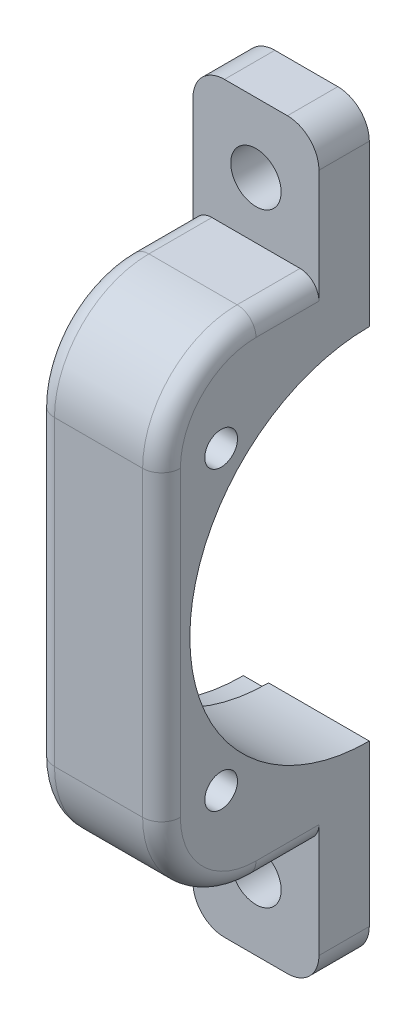
ISO-10303-21;
HEADER;
FILE_DESCRIPTION(('STEP AP214'),'2;1');
FILE_NAME('part.step','',(''),(''),'','','');
FILE_SCHEMA(('AUTOMOTIVE_DESIGN { 1 0 10303 214 1 1 1 1 }'));
ENDSEC;
DATA;
#1=APPLICATION_CONTEXT('core data for automotive mechanical design processes');
#2=APPLICATION_PROTOCOL_DEFINITION('international standard','automotive_design',2000,#1);
#3=PRODUCT_CONTEXT('',#1,'mechanical');
#4=PRODUCT('Part','Part','',(#3));
#5=PRODUCT_RELATED_PRODUCT_CATEGORY('part','',(#4));
#6=PRODUCT_DEFINITION_FORMATION('','',#4);
#7=PRODUCT_DEFINITION_CONTEXT('part definition',#1,'design');
#8=PRODUCT_DEFINITION('design','',#6,#7);
#9=PRODUCT_DEFINITION_SHAPE('','',#8);
#10=(LENGTH_UNIT() NAMED_UNIT(*) SI_UNIT(.MILLI.,.METRE.));
#11=(NAMED_UNIT(*) PLANE_ANGLE_UNIT() SI_UNIT($,.RADIAN.));
#12=(NAMED_UNIT(*) SI_UNIT($,.STERADIAN.) SOLID_ANGLE_UNIT());
#13=UNCERTAINTY_MEASURE_WITH_UNIT(LENGTH_MEASURE(1.E-05),#10,'distance_accuracy_value','');
#14=(GEOMETRIC_REPRESENTATION_CONTEXT(3) GLOBAL_UNCERTAINTY_ASSIGNED_CONTEXT((#13)) GLOBAL_UNIT_ASSIGNED_CONTEXT((#10,
#11,#12)) REPRESENTATION_CONTEXT('',''));
#15=CARTESIAN_POINT('',(0.,0.,0.));
#16=DIRECTION('',(0.,0.,1.));
#17=DIRECTION('',(1.,0.,0.));
#18=AXIS2_PLACEMENT_3D('',#15,#16,#17);
#19=CARTESIAN_POINT('',(-10.,39.,0.));
#20=DIRECTION('',(1.,0.,0.));
#21=DIRECTION('',(0.,0.,-1.));
#22=AXIS2_PLACEMENT_3D('',#19,#20,#21);
#23=CYLINDRICAL_SURFACE('',#22,28.5);
#24=CARTESIAN_POINT('',(4.,39.,0.));
#25=DIRECTION('',(-1.,0.,0.));
#26=DIRECTION('',(0.,0.,1.));
#27=AXIS2_PLACEMENT_3D('',#24,#25,#26);
#28=CIRCLE('',#27,28.5);
#29=CARTESIAN_POINT('',(4.,67.5,0.));
#30=VERTEX_POINT('',#29);
#31=CARTESIAN_POINT('',(4.,10.5,0.));
#32=VERTEX_POINT('',#31);
#33=EDGE_CURVE('E54',#30,#32,#28,.F.);
#34=ORIENTED_EDGE('',*,*,#33,.F.);
#35=DIRECTION('',(1.,0.,0.));
#36=VECTOR('',#35,1.);
#37=CARTESIAN_POINT('',(-10.,67.5,0.));
#38=LINE('',#37,#36);
#39=CARTESIAN_POINT('',(20.,67.5,0.));
#40=VERTEX_POINT('',#39);
#41=EDGE_CURVE('E305',#30,#40,#38,.T.);
#42=ORIENTED_EDGE('',*,*,#41,.T.);
#43=CARTESIAN_POINT('',(20.,39.,0.));
#44=DIRECTION('',(1.,0.,0.));
#45=DIRECTION('',(0.,0.,-1.));
#46=AXIS2_PLACEMENT_3D('',#43,#44,#45);
#47=CIRCLE('',#46,28.5);
#48=CARTESIAN_POINT('',(20.,10.5,0.));
#49=VERTEX_POINT('',#48);
#50=EDGE_CURVE('E443',#40,#49,#47,.T.);
#51=ORIENTED_EDGE('',*,*,#50,.T.);
#52=DIRECTION('',(1.,0.,0.));
#53=VECTOR('',#52,1.);
#54=CARTESIAN_POINT('',(-10.,10.5,0.));
#55=LINE('',#54,#53);
#56=EDGE_CURVE('E301',#49,#32,#55,.F.);
#57=ORIENTED_EDGE('',*,*,#56,.T.);
#58=EDGE_LOOP('',(#34,#42,#51,#57));
#59=FACE_BOUND('',#58,.T.);
#60=ADVANCED_FACE('F45',(#59),#23,.F.);
#61=CARTESIAN_POINT('',(0.,0.,0.));
#62=DIRECTION('',(0.,0.,-1.));
#63=DIRECTION('',(-1.,0.,0.));
#64=AXIS2_PLACEMENT_3D('',#61,#62,#63);
#65=PLANE('',#64);
#66=DIRECTION('',(-1.,0.,0.));
#67=VECTOR('',#66,1.);
#68=CARTESIAN_POINT('',(4.,68.5,0.));
#69=LINE('',#68,#67);
#70=CARTESIAN_POINT('',(0.,68.5,0.));
#71=VERTEX_POINT('',#70);
#72=CARTESIAN_POINT('',(4.,68.5,0.));
#73=VERTEX_POINT('',#72);
#74=EDGE_CURVE('E212',#71,#73,#69,.F.);
#75=ORIENTED_EDGE('',*,*,#74,.F.);
#76=DIRECTION('',(0.,-1.,0.));
#77=VECTOR('',#76,1.);
#78=CARTESIAN_POINT('',(0.,0.,0.));
#79=LINE('',#78,#77);
#80=CARTESIAN_POINT('',(0.,93.,0.));
#81=VERTEX_POINT('',#80);
#82=EDGE_CURVE('E224',#81,#71,#79,.T.);
#83=ORIENTED_EDGE('',*,*,#82,.F.);
#84=CARTESIAN_POINT('',(5.,93.,0.));
#85=DIRECTION('',(0.,0.,-1.));
#86=DIRECTION('',(-1.,0.,0.));
#87=AXIS2_PLACEMENT_3D('',#84,#85,#86);
#88=CIRCLE('',#87,5.);
#89=CARTESIAN_POINT('',(5.,98.,0.));
#90=VERTEX_POINT('',#89);
#91=EDGE_CURVE('E256',#81,#90,#88,.T.);
#92=ORIENTED_EDGE('',*,*,#91,.T.);
#93=DIRECTION('',(-1.,0.,0.));
#94=VECTOR('',#93,1.);
#95=CARTESIAN_POINT('',(0.,98.,0.));
#96=LINE('',#95,#94);
#97=CARTESIAN_POINT('',(15.,98.,0.));
#98=VERTEX_POINT('',#97);
#99=EDGE_CURVE('E495',#98,#90,#96,.T.);
#100=ORIENTED_EDGE('',*,*,#99,.F.);
#101=CARTESIAN_POINT('',(15.,93.,0.));
#102=DIRECTION('',(0.,0.,-1.));
#103=DIRECTION('',(-1.,0.,0.));
#104=AXIS2_PLACEMENT_3D('',#101,#102,#103);
#105=CIRCLE('',#104,5.);
#106=CARTESIAN_POINT('',(20.,93.,0.));
#107=VERTEX_POINT('',#106);
#108=EDGE_CURVE('E259',#98,#107,#105,.T.);
#109=ORIENTED_EDGE('',*,*,#108,.T.);
#110=DIRECTION('',(0.,1.,0.));
#111=VECTOR('',#110,1.);
#112=CARTESIAN_POINT('',(20.,0.,0.));
#113=LINE('',#112,#111);
#114=EDGE_CURVE('E235',#40,#107,#113,.T.);
#115=ORIENTED_EDGE('',*,*,#114,.F.);
#116=ORIENTED_EDGE('',*,*,#41,.F.);
#117=DIRECTION('',(0.,1.,0.));
#118=VECTOR('',#117,1.);
#119=CARTESIAN_POINT('',(4.,0.,0.));
#120=LINE('',#119,#118);
#121=EDGE_CURVE('E61',#30,#73,#120,.T.);
#122=ORIENTED_EDGE('',*,*,#121,.T.);
#123=EDGE_LOOP('',(#75,#83,#92,#100,#109,#115,#116,#122));
#124=FACE_BOUND('',#123,.T.);
#125=CARTESIAN_POINT('',(10.,87.,0.));
#126=DIRECTION('',(0.,0.,-1.));
#127=DIRECTION('',(-1.,0.,0.));
#128=AXIS2_PLACEMENT_3D('',#125,#126,#127);
#129=CIRCLE('',#128,4.);
#130=CARTESIAN_POINT('',(6.,87.,0.));
#131=VERTEX_POINT('',#130);
#132=EDGE_CURVE('E468',#131,#131,#129,.T.);
#133=ORIENTED_EDGE('',*,*,#132,.F.);
#134=EDGE_LOOP('',(#133));
#135=FACE_BOUND('',#134,.T.);
#136=ADVANCED_FACE('F222',(#124,#135),#65,.T.);
#137=CARTESIAN_POINT('',(0.,0.,33.));
#138=DIRECTION('',(0.,1.,0.));
#139=DIRECTION('',(0.,0.,1.));
#140=AXIS2_PLACEMENT_3D('',#137,#138,#139);
#141=PLANE('',#140);
#142=DIRECTION('',(1.,0.,0.));
#143=VECTOR('',#142,1.);
#144=CARTESIAN_POINT('',(0.,0.,18.));
#145=LINE('',#144,#143);
#146=CARTESIAN_POINT('',(17.,0.,18.));
#147=VERTEX_POINT('',#146);
#148=CARTESIAN_POINT('',(3.,0.,18.));
#149=VERTEX_POINT('',#148);
#150=EDGE_CURVE('E316',#147,#149,#145,.F.);
#151=ORIENTED_EDGE('',*,*,#150,.T.);
#152=DIRECTION('',(0.,0.,-1.));
#153=VECTOR('',#152,1.);
#154=CARTESIAN_POINT('',(3.,0.,33.));
#155=LINE('',#154,#153);
#156=CARTESIAN_POINT('',(3.,0.,8.));
#157=VERTEX_POINT('',#156);
#158=EDGE_CURVE('E326',#149,#157,#155,.T.);
#159=ORIENTED_EDGE('',*,*,#158,.T.);
#160=DIRECTION('',(-1.,0.,0.));
#161=VECTOR('',#160,1.);
#162=CARTESIAN_POINT('',(0.,0.,8.));
#163=LINE('',#162,#161);
#164=CARTESIAN_POINT('',(17.,0.,8.));
#165=VERTEX_POINT('',#164);
#166=EDGE_CURVE('E472',#165,#157,#163,.T.);
#167=ORIENTED_EDGE('',*,*,#166,.F.);
#168=DIRECTION('',(0.,0.,-1.));
#169=VECTOR('',#168,1.);
#170=CARTESIAN_POINT('',(17.,0.,33.));
#171=LINE('',#170,#169);
#172=EDGE_CURVE('E323',#165,#147,#171,.F.);
#173=ORIENTED_EDGE('',*,*,#172,.T.);
#174=EDGE_LOOP('',(#151,#159,#167,#173));
#175=FACE_BOUND('',#174,.T.);
#176=ADVANCED_FACE('F567',(#175),#141,.F.);
#177=CARTESIAN_POINT('',(0.,78.,33.));
#178=DIRECTION('',(0.,-1.,0.));
#179=DIRECTION('',(0.,0.,-1.));
#180=AXIS2_PLACEMENT_3D('',#177,#178,#179);
#181=PLANE('',#180);
#182=DIRECTION('',(1.,0.,0.));
#183=VECTOR('',#182,1.);
#184=CARTESIAN_POINT('',(0.,78.,8.));
#185=LINE('',#184,#183);
#186=CARTESIAN_POINT('',(3.,78.,8.));
#187=VERTEX_POINT('',#186);
#188=CARTESIAN_POINT('',(17.,78.,8.));
#189=VERTEX_POINT('',#188);
#190=EDGE_CURVE('E490',#187,#189,#185,.T.);
#191=ORIENTED_EDGE('',*,*,#190,.F.);
#192=DIRECTION('',(0.,0.,-1.));
#193=VECTOR('',#192,1.);
#194=CARTESIAN_POINT('',(3.,78.,33.));
#195=LINE('',#194,#193);
#196=CARTESIAN_POINT('',(3.,78.,18.));
#197=VERTEX_POINT('',#196);
#198=EDGE_CURVE('E382',#187,#197,#195,.F.);
#199=ORIENTED_EDGE('',*,*,#198,.T.);
#200=DIRECTION('',(-1.,0.,0.));
#201=VECTOR('',#200,1.);
#202=CARTESIAN_POINT('',(0.,78.,18.));
#203=LINE('',#202,#201);
#204=CARTESIAN_POINT('',(17.,78.,18.));
#205=VERTEX_POINT('',#204);
#206=EDGE_CURVE('E320',#197,#205,#203,.F.);
#207=ORIENTED_EDGE('',*,*,#206,.T.);
#208=DIRECTION('',(0.,0.,-1.));
#209=VECTOR('',#208,1.);
#210=CARTESIAN_POINT('',(17.,78.,33.));
#211=LINE('',#210,#209);
#212=EDGE_CURVE('E69',#205,#189,#211,.T.);
#213=ORIENTED_EDGE('',*,*,#212,.T.);
#214=EDGE_LOOP('',(#191,#199,#207,#213));
#215=FACE_BOUND('',#214,.T.);
#216=ADVANCED_FACE('F516',(#215),#181,.F.);
#217=CARTESIAN_POINT('',(0.,0.,33.));
#218=DIRECTION('',(1.,0.,0.));
#219=DIRECTION('',(0.,0.,-1.));
#220=AXIS2_PLACEMENT_3D('',#217,#218,#219);
#221=PLANE('',#220);
#222=CARTESIAN_POINT('',(0.,15.4710218560176,23.5289781439824));
#223=DIRECTION('',(1.,0.,0.));
#224=DIRECTION('',(0.,0.,-1.));
#225=AXIS2_PLACEMENT_3D('',#222,#223,#224);
#226=CIRCLE('',#225,2.60000000000003);
#227=CARTESIAN_POINT('',(0.,15.4710218560176,20.9289781439824));
#228=VERTEX_POINT('',#227);
#229=EDGE_CURVE('E448',#228,#228,#226,.T.);
#230=ORIENTED_EDGE('',*,*,#229,.T.);
#231=EDGE_LOOP('',(#230));
#232=FACE_BOUND('',#231,.T.);
#233=CARTESIAN_POINT('',(0.,62.5289781439823,23.5289781439824));
#234=DIRECTION('',(1.,0.,0.));
#235=DIRECTION('',(0.,0.,-1.));
#236=AXIS2_PLACEMENT_3D('',#233,#234,#235);
#237=CIRCLE('',#236,2.60000000000003);
#238=CARTESIAN_POINT('',(0.,62.5289781439823,20.9289781439824));
#239=VERTEX_POINT('',#238);
#240=EDGE_CURVE('E416',#239,#239,#237,.T.);
#241=ORIENTED_EDGE('',*,*,#240,.T.);
#242=EDGE_LOOP('',(#241));
#243=FACE_BOUND('',#242,.T.);
#244=ORIENTED_EDGE('',*,*,#82,.T.);
#245=CARTESIAN_POINT('',(0.,39.,0.));
#246=DIRECTION('',(-1.,0.,0.));
#247=DIRECTION('',(0.,0.,1.));
#248=AXIS2_PLACEMENT_3D('',#245,#246,#247);
#249=CIRCLE('',#248,29.5);
#250=CARTESIAN_POINT('',(0.,9.5,0.));
#251=VERTEX_POINT('',#250);
#252=EDGE_CURVE('E208',#251,#71,#249,.T.);
#253=ORIENTED_EDGE('',*,*,#252,.F.);
#254=CARTESIAN_POINT('',(0.,-15.,0.));
#255=VERTEX_POINT('',#254);
#256=EDGE_CURVE('E236',#251,#255,#79,.T.);
#257=ORIENTED_EDGE('',*,*,#256,.T.);
#258=DIRECTION('',(0.,0.,-1.));
#259=VECTOR('',#258,1.);
#260=CARTESIAN_POINT('',(0.,-15.,33.));
#261=LINE('',#260,#259);
#262=CARTESIAN_POINT('',(0.,-15.,8.));
#263=VERTEX_POINT('',#262);
#264=EDGE_CURVE('E272',#255,#263,#261,.F.);
#265=ORIENTED_EDGE('',*,*,#264,.T.);
#266=DIRECTION('',(0.,1.,0.));
#267=VECTOR('',#266,1.);
#268=CARTESIAN_POINT('',(0.,-20.,8.));
#269=LINE('',#268,#267);
#270=CARTESIAN_POINT('',(0.,3.,8.));
#271=VERTEX_POINT('',#270);
#272=EDGE_CURVE('E481',#263,#271,#269,.T.);
#273=ORIENTED_EDGE('',*,*,#272,.T.);
#274=DIRECTION('',(0.,0.,-1.));
#275=VECTOR('',#274,1.);
#276=CARTESIAN_POINT('',(0.,3.,33.));
#277=LINE('',#276,#275);
#278=CARTESIAN_POINT('',(0.,3.,18.));
#279=VERTEX_POINT('',#278);
#280=EDGE_CURVE('E343',#271,#279,#277,.F.);
#281=ORIENTED_EDGE('',*,*,#280,.T.);
#282=CARTESIAN_POINT('',(0.,15.,18.));
#283=DIRECTION('',(1.,0.,0.));
#284=DIRECTION('',(0.,0.,-1.));
#285=AXIS2_PLACEMENT_3D('',#282,#283,#284);
#286=CIRCLE('',#285,12.);
#287=CARTESIAN_POINT('',(0.,15.,30.));
#288=VERTEX_POINT('',#287);
#289=EDGE_CURVE('E340',#279,#288,#286,.F.);
#290=ORIENTED_EDGE('',*,*,#289,.T.);
#291=DIRECTION('',(0.,-1.,0.));
#292=VECTOR('',#291,1.);
#293=CARTESIAN_POINT('',(0.,0.,30.));
#294=LINE('',#293,#292);
#295=CARTESIAN_POINT('',(0.,63.,30.));
#296=VERTEX_POINT('',#295);
#297=EDGE_CURVE('E337',#288,#296,#294,.F.);
#298=ORIENTED_EDGE('',*,*,#297,.T.);
#299=CARTESIAN_POINT('',(0.,63.,18.));
#300=DIRECTION('',(1.,0.,0.));
#301=DIRECTION('',(0.,0.,-1.));
#302=AXIS2_PLACEMENT_3D('',#299,#300,#301);
#303=CIRCLE('',#302,12.);
#304=CARTESIAN_POINT('',(0.,75.,18.));
#305=VERTEX_POINT('',#304);
#306=EDGE_CURVE('E334',#296,#305,#303,.F.);
#307=ORIENTED_EDGE('',*,*,#306,.T.);
#308=DIRECTION('',(0.,0.,-1.));
#309=VECTOR('',#308,1.);
#310=CARTESIAN_POINT('',(0.,75.,33.));
#311=LINE('',#310,#309);
#312=CARTESIAN_POINT('',(0.,75.,8.));
#313=VERTEX_POINT('',#312);
#314=EDGE_CURVE('E330',#305,#313,#311,.T.);
#315=ORIENTED_EDGE('',*,*,#314,.T.);
#316=DIRECTION('',(0.,-1.,0.));
#317=VECTOR('',#316,1.);
#318=CARTESIAN_POINT('',(0.,98.,8.));
#319=LINE('',#318,#317);
#320=CARTESIAN_POINT('',(0.,93.,8.));
#321=VERTEX_POINT('',#320);
#322=EDGE_CURVE('E242',#321,#313,#319,.T.);
#323=ORIENTED_EDGE('',*,*,#322,.F.);
#324=DIRECTION('',(0.,0.,1.));
#325=VECTOR('',#324,1.);
#326=CARTESIAN_POINT('',(0.,93.,0.));
#327=LINE('',#326,#325);
#328=EDGE_CURVE('E233',#321,#81,#327,.F.);
#329=ORIENTED_EDGE('',*,*,#328,.T.);
#330=EDGE_LOOP('',(#244,#253,#257,#265,#273,#281,#290,#298,#307,#315,#323,#329));
#331=FACE_BOUND('',#330,.T.);
#332=ADVANCED_FACE('F230',(#232,#243,#331),#221,.F.);
#333=CARTESIAN_POINT('',(20.,0.,33.));
#334=DIRECTION('',(-1.,0.,0.));
#335=DIRECTION('',(0.,0.,1.));
#336=AXIS2_PLACEMENT_3D('',#333,#334,#335);
#337=PLANE('',#336);
#338=CARTESIAN_POINT('',(20.,15.4710218560176,23.5289781439824));
#339=DIRECTION('',(1.,0.,0.));
#340=DIRECTION('',(0.,0.,-1.));
#341=AXIS2_PLACEMENT_3D('',#338,#339,#340);
#342=CIRCLE('',#341,2.60000000000003);
#343=CARTESIAN_POINT('',(20.,15.4710218560176,20.9289781439824));
#344=VERTEX_POINT('',#343);
#345=EDGE_CURVE('E456',#344,#344,#342,.T.);
#346=ORIENTED_EDGE('',*,*,#345,.F.);
#347=EDGE_LOOP('',(#346));
#348=FACE_BOUND('',#347,.T.);
#349=CARTESIAN_POINT('',(20.,62.5289781439823,23.5289781439824));
#350=DIRECTION('',(1.,0.,0.));
#351=DIRECTION('',(0.,0.,-1.));
#352=AXIS2_PLACEMENT_3D('',#349,#350,#351);
#353=CIRCLE('',#352,2.60000000000003);
#354=CARTESIAN_POINT('',(20.,62.5289781439823,20.9289781439824));
#355=VERTEX_POINT('',#354);
#356=EDGE_CURVE('E910',#355,#355,#353,.T.);
#357=ORIENTED_EDGE('',*,*,#356,.F.);
#358=EDGE_LOOP('',(#357));
#359=FACE_BOUND('',#358,.T.);
#360=DIRECTION('',(0.,0.,-1.));
#361=VECTOR('',#360,1.);
#362=CARTESIAN_POINT('',(20.,3.,33.));
#363=LINE('',#362,#361);
#364=CARTESIAN_POINT('',(20.,3.,18.));
#365=VERTEX_POINT('',#364);
#366=CARTESIAN_POINT('',(20.,3.,8.));
#367=VERTEX_POINT('',#366);
#368=EDGE_CURVE('E376',#365,#367,#363,.T.);
#369=ORIENTED_EDGE('',*,*,#368,.T.);
#370=DIRECTION('',(0.,1.,0.));
#371=VECTOR('',#370,1.);
#372=CARTESIAN_POINT('',(20.,-20.,8.));
#373=LINE('',#372,#371);
#374=CARTESIAN_POINT('',(20.,-15.,8.));
#375=VERTEX_POINT('',#374);
#376=EDGE_CURVE('E487',#375,#367,#373,.T.);
#377=ORIENTED_EDGE('',*,*,#376,.F.);
#378=DIRECTION('',(0.,0.,1.));
#379=VECTOR('',#378,1.);
#380=CARTESIAN_POINT('',(20.,-15.,33.));
#381=LINE('',#380,#379);
#382=CARTESIAN_POINT('',(20.,-15.,0.));
#383=VERTEX_POINT('',#382);
#384=EDGE_CURVE('E284',#375,#383,#381,.F.);
#385=ORIENTED_EDGE('',*,*,#384,.T.);
#386=EDGE_CURVE('E240',#383,#49,#113,.T.);
#387=ORIENTED_EDGE('',*,*,#386,.T.);
#388=ORIENTED_EDGE('',*,*,#50,.F.);
#389=ORIENTED_EDGE('',*,*,#114,.T.);
#390=DIRECTION('',(0.,0.,-1.));
#391=VECTOR('',#390,1.);
#392=CARTESIAN_POINT('',(20.,93.,8.));
#393=LINE('',#392,#391);
#394=CARTESIAN_POINT('',(20.,93.,8.));
#395=VERTEX_POINT('',#394);
#396=EDGE_CURVE('E281',#107,#395,#393,.F.);
#397=ORIENTED_EDGE('',*,*,#396,.T.);
#398=DIRECTION('',(0.,-1.,0.));
#399=VECTOR('',#398,1.);
#400=CARTESIAN_POINT('',(20.,98.,8.));
#401=LINE('',#400,#399);
#402=CARTESIAN_POINT('',(20.,75.,8.));
#403=VERTEX_POINT('',#402);
#404=EDGE_CURVE('E499',#395,#403,#401,.T.);
#405=ORIENTED_EDGE('',*,*,#404,.T.);
#406=DIRECTION('',(0.,0.,-1.));
#407=VECTOR('',#406,1.);
#408=CARTESIAN_POINT('',(20.,75.,33.));
#409=LINE('',#408,#407);
#410=CARTESIAN_POINT('',(20.,75.,18.));
#411=VERTEX_POINT('',#410);
#412=EDGE_CURVE('E364',#403,#411,#409,.F.);
#413=ORIENTED_EDGE('',*,*,#412,.T.);
#414=CARTESIAN_POINT('',(20.,63.,18.));
#415=DIRECTION('',(-1.,0.,0.));
#416=DIRECTION('',(0.,0.,1.));
#417=AXIS2_PLACEMENT_3D('',#414,#415,#416);
#418=CIRCLE('',#417,12.);
#419=CARTESIAN_POINT('',(20.,63.,30.));
#420=VERTEX_POINT('',#419);
#421=EDGE_CURVE('E367',#411,#420,#418,.F.);
#422=ORIENTED_EDGE('',*,*,#421,.T.);
#423=DIRECTION('',(0.,1.,0.));
#424=VECTOR('',#423,1.);
#425=CARTESIAN_POINT('',(20.,0.,30.));
#426=LINE('',#425,#424);
#427=CARTESIAN_POINT('',(20.,15.,30.));
#428=VERTEX_POINT('',#427);
#429=EDGE_CURVE('E370',#420,#428,#426,.F.);
#430=ORIENTED_EDGE('',*,*,#429,.T.);
#431=CARTESIAN_POINT('',(20.,15.,18.));
#432=DIRECTION('',(-1.,0.,0.));
#433=DIRECTION('',(0.,0.,1.));
#434=AXIS2_PLACEMENT_3D('',#431,#432,#433);
#435=CIRCLE('',#434,12.);
#436=EDGE_CURVE('E373',#428,#365,#435,.F.);
#437=ORIENTED_EDGE('',*,*,#436,.T.);
#438=EDGE_LOOP('',(#369,#377,#385,#387,#388,#389,#397,#405,#413,#422,#430,#437));
#439=FACE_BOUND('',#438,.T.);
#440=ADVANCED_FACE('F532',(#348,#359,#439),#337,.F.);
#441=CARTESIAN_POINT('',(0.,0.,33.));
#442=DIRECTION('',(0.,0.,-1.));
#443=DIRECTION('',(-1.,0.,0.));
#444=AXIS2_PLACEMENT_3D('',#441,#442,#443);
#445=PLANE('',#444);
#446=DIRECTION('',(-1.,0.,0.));
#447=VECTOR('',#446,1.);
#448=CARTESIAN_POINT('',(0.,63.,33.));
#449=LINE('',#448,#447);
#450=CARTESIAN_POINT('',(17.,63.,33.));
#451=VERTEX_POINT('',#450);
#452=CARTESIAN_POINT('',(3.,63.,33.));
#453=VERTEX_POINT('',#452);
#454=EDGE_CURVE('E308',#451,#453,#449,.T.);
#455=ORIENTED_EDGE('',*,*,#454,.T.);
#456=DIRECTION('',(0.,-1.,0.));
#457=VECTOR('',#456,1.);
#458=CARTESIAN_POINT('',(3.,0.,33.));
#459=LINE('',#458,#457);
#460=CARTESIAN_POINT('',(3.,15.,33.));
#461=VERTEX_POINT('',#460);
#462=EDGE_CURVE('E355',#453,#461,#459,.T.);
#463=ORIENTED_EDGE('',*,*,#462,.T.);
#464=DIRECTION('',(1.,0.,0.));
#465=VECTOR('',#464,1.);
#466=CARTESIAN_POINT('',(0.,15.,33.));
#467=LINE('',#466,#465);
#468=CARTESIAN_POINT('',(17.,15.,33.));
#469=VERTEX_POINT('',#468);
#470=EDGE_CURVE('E312',#461,#469,#467,.T.);
#471=ORIENTED_EDGE('',*,*,#470,.T.);
#472=DIRECTION('',(0.,1.,0.));
#473=VECTOR('',#472,1.);
#474=CARTESIAN_POINT('',(17.,0.,33.));
#475=LINE('',#474,#473);
#476=EDGE_CURVE('E352',#469,#451,#475,.T.);
#477=ORIENTED_EDGE('',*,*,#476,.T.);
#478=EDGE_LOOP('',(#455,#463,#471,#477));
#479=FACE_BOUND('',#478,.T.);
#480=ADVANCED_FACE('F593',(#479),#445,.F.);
#481=DIRECTION('',(-1.,0.,0.));
#482=VECTOR('',#481,1.);
#483=CARTESIAN_POINT('',(4.,9.5,0.));
#484=LINE('',#483,#482);
#485=CARTESIAN_POINT('',(4.,9.5,0.));
#486=VERTEX_POINT('',#485);
#487=EDGE_CURVE('E11',#486,#251,#484,.T.);
#488=ORIENTED_EDGE('',*,*,#487,.F.);
#489=DIRECTION('',(0.,1.,0.));
#490=VECTOR('',#489,1.);
#491=CARTESIAN_POINT('',(4.,0.,0.));
#492=LINE('',#491,#490);
#493=EDGE_CURVE('E433',#486,#32,#492,.T.);
#494=ORIENTED_EDGE('',*,*,#493,.T.);
#495=ORIENTED_EDGE('',*,*,#56,.F.);
#496=ORIENTED_EDGE('',*,*,#386,.F.);
#497=CARTESIAN_POINT('',(15.,-15.,0.));
#498=DIRECTION('',(0.,0.,-1.));
#499=DIRECTION('',(-1.,0.,0.));
#500=AXIS2_PLACEMENT_3D('',#497,#498,#499);
#501=CIRCLE('',#500,5.);
#502=CARTESIAN_POINT('',(15.,-20.,0.));
#503=VERTEX_POINT('',#502);
#504=EDGE_CURVE('E263',#383,#503,#501,.T.);
#505=ORIENTED_EDGE('',*,*,#504,.T.);
#506=DIRECTION('',(1.,0.,0.));
#507=VECTOR('',#506,1.);
#508=CARTESIAN_POINT('',(0.,-20.,0.));
#509=LINE('',#508,#507);
#510=CARTESIAN_POINT('',(5.,-20.,0.));
#511=VERTEX_POINT('',#510);
#512=EDGE_CURVE('E473',#511,#503,#509,.T.);
#513=ORIENTED_EDGE('',*,*,#512,.F.);
#514=CARTESIAN_POINT('',(5.,-15.,0.));
#515=DIRECTION('',(0.,0.,-1.));
#516=DIRECTION('',(-1.,0.,0.));
#517=AXIS2_PLACEMENT_3D('',#514,#515,#516);
#518=CIRCLE('',#517,5.);
#519=EDGE_CURVE('E266',#511,#255,#518,.T.);
#520=ORIENTED_EDGE('',*,*,#519,.T.);
#521=ORIENTED_EDGE('',*,*,#256,.F.);
#522=EDGE_LOOP('',(#488,#494,#495,#496,#505,#513,#520,#521));
#523=FACE_BOUND('',#522,.T.);
#524=CARTESIAN_POINT('',(10.,-8.99999999999995,0.));
#525=DIRECTION('',(0.,0.,-1.));
#526=DIRECTION('',(-1.,0.,0.));
#527=AXIS2_PLACEMENT_3D('',#524,#525,#526);
#528=CIRCLE('',#527,4.);
#529=CARTESIAN_POINT('',(6.,-8.99999999999995,0.));
#530=VERTEX_POINT('',#529);
#531=EDGE_CURVE('E463',#530,#530,#528,.T.);
#532=ORIENTED_EDGE('',*,*,#531,.F.);
#533=EDGE_LOOP('',(#532));
#534=FACE_BOUND('',#533,.T.);
#535=ADVANCED_FACE('F437',(#523,#534),#65,.T.);
#536=CARTESIAN_POINT('',(0.,98.,8.));
#537=DIRECTION('',(0.,0.,-1.));
#538=DIRECTION('',(-1.,0.,0.));
#539=AXIS2_PLACEMENT_3D('',#536,#537,#538);
#540=PLANE('',#539);
#541=CARTESIAN_POINT('',(10.,87.,8.));
#542=DIRECTION('',(0.,0.,1.));
#543=DIRECTION('',(1.,0.,0.));
#544=AXIS2_PLACEMENT_3D('',#541,#542,#543);
#545=CIRCLE('',#544,4.);
#546=CARTESIAN_POINT('',(14.,87.,8.));
#547=VERTEX_POINT('',#546);
#548=EDGE_CURVE('E453',#547,#547,#545,.T.);
#549=ORIENTED_EDGE('',*,*,#548,.F.);
#550=EDGE_LOOP('',(#549));
#551=FACE_BOUND('',#550,.T.);
#552=ORIENTED_EDGE('',*,*,#404,.F.);
#553=CARTESIAN_POINT('',(15.,93.,8.));
#554=DIRECTION('',(0.,0.,-1.));
#555=DIRECTION('',(-1.,0.,0.));
#556=AXIS2_PLACEMENT_3D('',#553,#554,#555);
#557=CIRCLE('',#556,5.);
#558=CARTESIAN_POINT('',(15.,98.,8.));
#559=VERTEX_POINT('',#558);
#560=EDGE_CURVE('E298',#395,#559,#557,.F.);
#561=ORIENTED_EDGE('',*,*,#560,.T.);
#562=DIRECTION('',(1.,0.,0.));
#563=VECTOR('',#562,1.);
#564=CARTESIAN_POINT('',(0.,98.,8.));
#565=LINE('',#564,#563);
#566=CARTESIAN_POINT('',(5.,98.,8.));
#567=VERTEX_POINT('',#566);
#568=EDGE_CURVE('E491',#567,#559,#565,.T.);
#569=ORIENTED_EDGE('',*,*,#568,.F.);
#570=CARTESIAN_POINT('',(5.,93.,8.));
#571=DIRECTION('',(0.,0.,-1.));
#572=DIRECTION('',(-1.,0.,0.));
#573=AXIS2_PLACEMENT_3D('',#570,#571,#572);
#574=CIRCLE('',#573,5.);
#575=EDGE_CURVE('E295',#567,#321,#574,.F.);
#576=ORIENTED_EDGE('',*,*,#575,.T.);
#577=ORIENTED_EDGE('',*,*,#322,.T.);
#578=CARTESIAN_POINT('',(3.,75.,8.));
#579=DIRECTION('',(0.,0.,-1.));
#580=DIRECTION('',(-1.,0.,0.));
#581=AXIS2_PLACEMENT_3D('',#578,#579,#580);
#582=CIRCLE('',#581,3.);
#583=EDGE_CURVE('E392',#313,#187,#582,.T.);
#584=ORIENTED_EDGE('',*,*,#583,.T.);
#585=ORIENTED_EDGE('',*,*,#190,.T.);
#586=CARTESIAN_POINT('',(17.,75.,8.));
#587=DIRECTION('',(0.,0.,-1.));
#588=DIRECTION('',(-1.,0.,0.));
#589=AXIS2_PLACEMENT_3D('',#586,#587,#588);
#590=CIRCLE('',#589,3.);
#591=EDGE_CURVE('E395',#189,#403,#590,.T.);
#592=ORIENTED_EDGE('',*,*,#591,.T.);
#593=EDGE_LOOP('',(#552,#561,#569,#576,#577,#584,#585,#592));
#594=FACE_BOUND('',#593,.T.);
#595=ADVANCED_FACE('F505',(#551,#594),#540,.F.);
#596=CARTESIAN_POINT('',(0.,98.,0.));
#597=DIRECTION('',(0.,1.,0.));
#598=DIRECTION('',(0.,0.,1.));
#599=AXIS2_PLACEMENT_3D('',#596,#597,#598);
#600=PLANE('',#599);
#601=ORIENTED_EDGE('',*,*,#568,.T.);
#602=DIRECTION('',(0.,0.,-1.));
#603=VECTOR('',#602,1.);
#604=CARTESIAN_POINT('',(15.,98.,0.));
#605=LINE('',#604,#603);
#606=EDGE_CURVE('E291',#559,#98,#605,.T.);
#607=ORIENTED_EDGE('',*,*,#606,.T.);
#608=ORIENTED_EDGE('',*,*,#99,.T.);
#609=DIRECTION('',(0.,0.,1.));
#610=VECTOR('',#609,1.);
#611=CARTESIAN_POINT('',(5.,98.,8.));
#612=LINE('',#611,#610);
#613=EDGE_CURVE('E287',#90,#567,#612,.T.);
#614=ORIENTED_EDGE('',*,*,#613,.T.);
#615=EDGE_LOOP('',(#601,#607,#608,#614));
#616=FACE_BOUND('',#615,.T.);
#617=ADVANCED_FACE('F544',(#616),#600,.T.);
#618=CARTESIAN_POINT('',(0.,-20.,8.));
#619=DIRECTION('',(0.,0.,-1.));
#620=DIRECTION('',(-1.,0.,0.));
#621=AXIS2_PLACEMENT_3D('',#618,#619,#620);
#622=PLANE('',#621);
#623=CARTESIAN_POINT('',(10.,-8.99999999999995,8.));
#624=DIRECTION('',(0.,0.,1.));
#625=DIRECTION('',(-1.,0.,0.));
#626=AXIS2_PLACEMENT_3D('',#623,#624,#625);
#627=CIRCLE('',#626,4.);
#628=CARTESIAN_POINT('',(6.,-8.99999999999995,8.));
#629=VERTEX_POINT('',#628);
#630=EDGE_CURVE('E447',#629,#629,#627,.T.);
#631=ORIENTED_EDGE('',*,*,#630,.F.);
#632=EDGE_LOOP('',(#631));
#633=FACE_BOUND('',#632,.T.);
#634=ORIENTED_EDGE('',*,*,#272,.F.);
#635=CARTESIAN_POINT('',(5.,-15.,8.));
#636=DIRECTION('',(0.,0.,-1.));
#637=DIRECTION('',(-1.,0.,0.));
#638=AXIS2_PLACEMENT_3D('',#635,#636,#637);
#639=CIRCLE('',#638,5.);
#640=CARTESIAN_POINT('',(5.,-20.,8.));
#641=VERTEX_POINT('',#640);
#642=EDGE_CURVE('E278',#263,#641,#639,.F.);
#643=ORIENTED_EDGE('',*,*,#642,.T.);
#644=DIRECTION('',(-1.,0.,0.));
#645=VECTOR('',#644,1.);
#646=CARTESIAN_POINT('',(0.,-20.,8.));
#647=LINE('',#646,#645);
#648=CARTESIAN_POINT('',(15.,-20.,8.));
#649=VERTEX_POINT('',#648);
#650=EDGE_CURVE('E477',#649,#641,#647,.T.);
#651=ORIENTED_EDGE('',*,*,#650,.F.);
#652=CARTESIAN_POINT('',(15.,-15.,8.));
#653=DIRECTION('',(0.,0.,-1.));
#654=DIRECTION('',(-1.,0.,0.));
#655=AXIS2_PLACEMENT_3D('',#652,#653,#654);
#656=CIRCLE('',#655,5.);
#657=EDGE_CURVE('E275',#649,#375,#656,.F.);
#658=ORIENTED_EDGE('',*,*,#657,.T.);
#659=ORIENTED_EDGE('',*,*,#376,.T.);
#660=CARTESIAN_POINT('',(17.,3.,8.));
#661=DIRECTION('',(0.,0.,-1.));
#662=DIRECTION('',(-1.,0.,0.));
#663=AXIS2_PLACEMENT_3D('',#660,#661,#662);
#664=CIRCLE('',#663,3.);
#665=EDGE_CURVE('E389',#367,#165,#664,.T.);
#666=ORIENTED_EDGE('',*,*,#665,.T.);
#667=ORIENTED_EDGE('',*,*,#166,.T.);
#668=CARTESIAN_POINT('',(3.,3.,8.));
#669=DIRECTION('',(0.,0.,-1.));
#670=DIRECTION('',(-1.,0.,0.));
#671=AXIS2_PLACEMENT_3D('',#668,#669,#670);
#672=CIRCLE('',#671,3.);
#673=EDGE_CURVE('E385',#157,#271,#672,.T.);
#674=ORIENTED_EDGE('',*,*,#673,.T.);
#675=EDGE_LOOP('',(#634,#643,#651,#658,#659,#666,#667,#674));
#676=FACE_BOUND('',#675,.T.);
#677=ADVANCED_FACE('F583',(#633,#676),#622,.F.);
#678=CARTESIAN_POINT('',(0.,-20.,0.));
#679=DIRECTION('',(0.,1.,0.));
#680=DIRECTION('',(0.,0.,1.));
#681=AXIS2_PLACEMENT_3D('',#678,#679,#680);
#682=PLANE('',#681);
#683=ORIENTED_EDGE('',*,*,#650,.T.);
#684=DIRECTION('',(0.,0.,-1.));
#685=VECTOR('',#684,1.);
#686=CARTESIAN_POINT('',(5.,-20.,0.));
#687=LINE('',#686,#685);
#688=EDGE_CURVE('E252',#641,#511,#687,.T.);
#689=ORIENTED_EDGE('',*,*,#688,.T.);
#690=ORIENTED_EDGE('',*,*,#512,.T.);
#691=DIRECTION('',(0.,0.,1.));
#692=VECTOR('',#691,1.);
#693=CARTESIAN_POINT('',(15.,-20.,0.));
#694=LINE('',#693,#692);
#695=EDGE_CURVE('E248',#503,#649,#694,.T.);
#696=ORIENTED_EDGE('',*,*,#695,.T.);
#697=EDGE_LOOP('',(#683,#689,#690,#696));
#698=FACE_BOUND('',#697,.T.);
#699=ADVANCED_FACE('F579',(#698),#682,.F.);
#700=CARTESIAN_POINT('',(10.,-8.99999999999995,-2.));
#701=DIRECTION('',(0.,0.,1.));
#702=DIRECTION('',(1.,0.,0.));
#703=AXIS2_PLACEMENT_3D('',#700,#701,#702);
#704=CYLINDRICAL_SURFACE('',#703,4.);
#705=ORIENTED_EDGE('',*,*,#531,.T.);
#706=EDGE_LOOP('',(#705));
#707=FACE_BOUND('',#706,.T.);
#708=ORIENTED_EDGE('',*,*,#630,.T.);
#709=EDGE_LOOP('',(#708));
#710=FACE_BOUND('',#709,.T.);
#711=ADVANCED_FACE('F575',(#707,#710),#704,.F.);
#712=CARTESIAN_POINT('',(10.,87.,-2.));
#713=DIRECTION('',(0.,0.,1.));
#714=DIRECTION('',(1.,0.,0.));
#715=AXIS2_PLACEMENT_3D('',#712,#713,#714);
#716=CYLINDRICAL_SURFACE('',#715,4.);
#717=ORIENTED_EDGE('',*,*,#132,.T.);
#718=EDGE_LOOP('',(#717));
#719=FACE_BOUND('',#718,.T.);
#720=ORIENTED_EDGE('',*,*,#548,.T.);
#721=EDGE_LOOP('',(#720));
#722=FACE_BOUND('',#721,.T.);
#723=ADVANCED_FACE('F571',(#719,#722),#716,.F.);
#724=CARTESIAN_POINT('',(5.,-15.,0.));
#725=DIRECTION('',(0.,0.,-1.));
#726=DIRECTION('',(-1.,0.,0.));
#727=AXIS2_PLACEMENT_3D('',#724,#725,#726);
#728=CYLINDRICAL_SURFACE('',#727,5.);
#729=ORIENTED_EDGE('',*,*,#642,.F.);
#730=ORIENTED_EDGE('',*,*,#264,.F.);
#731=ORIENTED_EDGE('',*,*,#519,.F.);
#732=ORIENTED_EDGE('',*,*,#688,.F.);
#733=EDGE_LOOP('',(#729,#730,#731,#732));
#734=FACE_BOUND('',#733,.T.);
#735=ADVANCED_FACE('F574',(#734),#728,.T.);
#736=CARTESIAN_POINT('',(15.,-15.,0.));
#737=DIRECTION('',(0.,0.,1.));
#738=DIRECTION('',(1.,0.,0.));
#739=AXIS2_PLACEMENT_3D('',#736,#737,#738);
#740=CYLINDRICAL_SURFACE('',#739,5.);
#741=ORIENTED_EDGE('',*,*,#504,.F.);
#742=ORIENTED_EDGE('',*,*,#384,.F.);
#743=ORIENTED_EDGE('',*,*,#657,.F.);
#744=ORIENTED_EDGE('',*,*,#695,.F.);
#745=EDGE_LOOP('',(#741,#742,#743,#744));
#746=FACE_BOUND('',#745,.T.);
#747=ADVANCED_FACE('F558',(#746),#740,.T.);
#748=CARTESIAN_POINT('',(15.,93.,0.));
#749=DIRECTION('',(0.,0.,1.));
#750=DIRECTION('',(1.,0.,0.));
#751=AXIS2_PLACEMENT_3D('',#748,#749,#750);
#752=CYLINDRICAL_SURFACE('',#751,5.);
#753=ORIENTED_EDGE('',*,*,#560,.F.);
#754=ORIENTED_EDGE('',*,*,#396,.F.);
#755=ORIENTED_EDGE('',*,*,#108,.F.);
#756=ORIENTED_EDGE('',*,*,#606,.F.);
#757=EDGE_LOOP('',(#753,#754,#755,#756));
#758=FACE_BOUND('',#757,.T.);
#759=ADVANCED_FACE('F541',(#758),#752,.T.);
#760=CARTESIAN_POINT('',(5.,93.,0.));
#761=DIRECTION('',(0.,0.,-1.));
#762=DIRECTION('',(-1.,0.,0.));
#763=AXIS2_PLACEMENT_3D('',#760,#761,#762);
#764=CYLINDRICAL_SURFACE('',#763,5.);
#765=ORIENTED_EDGE('',*,*,#91,.F.);
#766=ORIENTED_EDGE('',*,*,#328,.F.);
#767=ORIENTED_EDGE('',*,*,#575,.F.);
#768=ORIENTED_EDGE('',*,*,#613,.F.);
#769=EDGE_LOOP('',(#765,#766,#767,#768));
#770=FACE_BOUND('',#769,.T.);
#771=ADVANCED_FACE('F547',(#770),#764,.T.);
#772=CARTESIAN_POINT('',(0.,62.5289781439823,23.5289781439824));
#773=DIRECTION('',(1.,0.,0.));
#774=DIRECTION('',(0.,0.,-1.));
#775=AXIS2_PLACEMENT_3D('',#772,#773,#774);
#776=CYLINDRICAL_SURFACE('',#775,2.60000000000003);
#777=ORIENTED_EDGE('',*,*,#240,.F.);
#778=EDGE_LOOP('',(#777));
#779=FACE_BOUND('',#778,.T.);
#780=ORIENTED_EDGE('',*,*,#356,.T.);
#781=EDGE_LOOP('',(#780));
#782=FACE_BOUND('',#781,.T.);
#783=ADVANCED_FACE('F549',(#779,#782),#776,.F.);
#784=CARTESIAN_POINT('',(0.,15.4710218560176,23.5289781439824));
#785=DIRECTION('',(1.,0.,0.));
#786=DIRECTION('',(0.,0.,-1.));
#787=AXIS2_PLACEMENT_3D('',#784,#785,#786);
#788=CYLINDRICAL_SURFACE('',#787,2.60000000000003);
#789=ORIENTED_EDGE('',*,*,#229,.F.);
#790=EDGE_LOOP('',(#789));
#791=FACE_BOUND('',#790,.T.);
#792=ORIENTED_EDGE('',*,*,#345,.T.);
#793=EDGE_LOOP('',(#792));
#794=FACE_BOUND('',#793,.T.);
#795=ADVANCED_FACE('F555',(#791,#794),#788,.F.);
#796=CARTESIAN_POINT('',(0.,15.,18.));
#797=DIRECTION('',(1.,0.,0.));
#798=DIRECTION('',(0.,0.,-1.));
#799=AXIS2_PLACEMENT_3D('',#796,#797,#798);
#800=CYLINDRICAL_SURFACE('',#799,15.);
#801=ORIENTED_EDGE('',*,*,#470,.F.);
#802=CARTESIAN_POINT('',(3.,15.,18.));
#803=DIRECTION('',(1.,0.,0.));
#804=DIRECTION('',(0.,0.,-1.));
#805=AXIS2_PLACEMENT_3D('',#802,#803,#804);
#806=CIRCLE('',#805,15.);
#807=EDGE_CURVE('E349',#461,#149,#806,.T.);
#808=ORIENTED_EDGE('',*,*,#807,.T.);
#809=ORIENTED_EDGE('',*,*,#150,.F.);
#810=CARTESIAN_POINT('',(17.,15.,18.));
#811=DIRECTION('',(-1.,0.,0.));
#812=DIRECTION('',(0.,0.,1.));
#813=AXIS2_PLACEMENT_3D('',#810,#811,#812);
#814=CIRCLE('',#813,15.);
#815=EDGE_CURVE('E346',#147,#469,#814,.T.);
#816=ORIENTED_EDGE('',*,*,#815,.T.);
#817=EDGE_LOOP('',(#801,#808,#809,#816));
#818=FACE_BOUND('',#817,.T.);
#819=ADVANCED_FACE('F675',(#818),#800,.T.);
#820=CARTESIAN_POINT('',(0.,63.,18.));
#821=DIRECTION('',(-1.,0.,0.));
#822=DIRECTION('',(0.,0.,1.));
#823=AXIS2_PLACEMENT_3D('',#820,#821,#822);
#824=CYLINDRICAL_SURFACE('',#823,15.);
#825=ORIENTED_EDGE('',*,*,#206,.F.);
#826=CARTESIAN_POINT('',(3.,63.,18.));
#827=DIRECTION('',(1.,0.,0.));
#828=DIRECTION('',(0.,0.,-1.));
#829=AXIS2_PLACEMENT_3D('',#826,#827,#828);
#830=CIRCLE('',#829,15.);
#831=EDGE_CURVE('E361',#197,#453,#830,.T.);
#832=ORIENTED_EDGE('',*,*,#831,.T.);
#833=ORIENTED_EDGE('',*,*,#454,.F.);
#834=CARTESIAN_POINT('',(17.,63.,18.));
#835=DIRECTION('',(-1.,0.,0.));
#836=DIRECTION('',(0.,0.,1.));
#837=AXIS2_PLACEMENT_3D('',#834,#835,#836);
#838=CIRCLE('',#837,15.);
#839=EDGE_CURVE('E358',#451,#205,#838,.T.);
#840=ORIENTED_EDGE('',*,*,#839,.T.);
#841=EDGE_LOOP('',(#825,#832,#833,#840));
#842=FACE_BOUND('',#841,.T.);
#843=ADVANCED_FACE('F518',(#842),#824,.T.);
#844=CARTESIAN_POINT('',(3.,75.,33.));
#845=DIRECTION('',(0.,0.,-1.));
#846=DIRECTION('',(-1.,0.,0.));
#847=AXIS2_PLACEMENT_3D('',#844,#845,#846);
#848=CYLINDRICAL_SURFACE('',#847,3.);
#849=ORIENTED_EDGE('',*,*,#583,.F.);
#850=ORIENTED_EDGE('',*,*,#314,.F.);
#851=CARTESIAN_POINT('',(3.,75.,18.));
#852=DIRECTION('',(0.,0.,1.));
#853=DIRECTION('',(1.,0.,0.));
#854=AXIS2_PLACEMENT_3D('',#851,#852,#853);
#855=CIRCLE('',#854,3.);
#856=EDGE_CURVE('E412',#197,#305,#855,.T.);
#857=ORIENTED_EDGE('',*,*,#856,.F.);
#858=ORIENTED_EDGE('',*,*,#198,.F.);
#859=EDGE_LOOP('',(#849,#850,#857,#858));
#860=FACE_BOUND('',#859,.T.);
#861=ADVANCED_FACE('F513',(#860),#848,.T.);
#862=CARTESIAN_POINT('',(3.,63.,18.));
#863=DIRECTION('',(1.,0.,0.));
#864=DIRECTION('',(0.,0.,-1.));
#865=AXIS2_PLACEMENT_3D('',#862,#863,#864);
#866=TOROIDAL_SURFACE('',#865,12.,3.);
#867=ORIENTED_EDGE('',*,*,#856,.T.);
#868=ORIENTED_EDGE('',*,*,#306,.F.);
#869=CARTESIAN_POINT('',(3.,63.,30.));
#870=DIRECTION('',(0.,-1.,0.));
#871=DIRECTION('',(0.,0.,-1.));
#872=AXIS2_PLACEMENT_3D('',#869,#870,#871);
#873=CIRCLE('',#872,3.);
#874=EDGE_CURVE('E408',#453,#296,#873,.T.);
#875=ORIENTED_EDGE('',*,*,#874,.F.);
#876=ORIENTED_EDGE('',*,*,#831,.F.);
#877=EDGE_LOOP('',(#867,#868,#875,#876));
#878=FACE_BOUND('',#877,.T.);
#879=ADVANCED_FACE('F643',(#878),#866,.T.);
#880=CARTESIAN_POINT('',(3.,0.,30.));
#881=DIRECTION('',(0.,-1.,0.));
#882=DIRECTION('',(0.,0.,-1.));
#883=AXIS2_PLACEMENT_3D('',#880,#881,#882);
#884=CYLINDRICAL_SURFACE('',#883,3.);
#885=ORIENTED_EDGE('',*,*,#874,.T.);
#886=ORIENTED_EDGE('',*,*,#297,.F.);
#887=CARTESIAN_POINT('',(3.,15.,30.));
#888=DIRECTION('',(0.,-1.,0.));
#889=DIRECTION('',(0.,0.,-1.));
#890=AXIS2_PLACEMENT_3D('',#887,#888,#889);
#891=CIRCLE('',#890,3.);
#892=EDGE_CURVE('E403',#461,#288,#891,.T.);
#893=ORIENTED_EDGE('',*,*,#892,.F.);
#894=ORIENTED_EDGE('',*,*,#462,.F.);
#895=EDGE_LOOP('',(#885,#886,#893,#894));
#896=FACE_BOUND('',#895,.T.);
#897=ADVANCED_FACE('F640',(#896),#884,.T.);
#898=CARTESIAN_POINT('',(3.,15.,18.));
#899=DIRECTION('',(1.,0.,0.));
#900=DIRECTION('',(0.,0.,-1.));
#901=AXIS2_PLACEMENT_3D('',#898,#899,#900);
#902=TOROIDAL_SURFACE('',#901,12.,3.);
#903=ORIENTED_EDGE('',*,*,#892,.T.);
#904=ORIENTED_EDGE('',*,*,#289,.F.);
#905=CARTESIAN_POINT('',(3.,3.,18.));
#906=DIRECTION('',(0.,0.,-1.));
#907=DIRECTION('',(-1.,0.,0.));
#908=AXIS2_PLACEMENT_3D('',#905,#906,#907);
#909=CIRCLE('',#908,3.);
#910=EDGE_CURVE('E399',#149,#279,#909,.T.);
#911=ORIENTED_EDGE('',*,*,#910,.F.);
#912=ORIENTED_EDGE('',*,*,#807,.F.);
#913=EDGE_LOOP('',(#903,#904,#911,#912));
#914=FACE_BOUND('',#913,.T.);
#915=ADVANCED_FACE('F635',(#914),#902,.T.);
#916=CARTESIAN_POINT('',(3.,3.,33.));
#917=DIRECTION('',(0.,0.,-1.));
#918=DIRECTION('',(-1.,0.,0.));
#919=AXIS2_PLACEMENT_3D('',#916,#917,#918);
#920=CYLINDRICAL_SURFACE('',#919,3.);
#921=ORIENTED_EDGE('',*,*,#910,.T.);
#922=ORIENTED_EDGE('',*,*,#280,.F.);
#923=ORIENTED_EDGE('',*,*,#673,.F.);
#924=ORIENTED_EDGE('',*,*,#158,.F.);
#925=EDGE_LOOP('',(#921,#922,#923,#924));
#926=FACE_BOUND('',#925,.T.);
#927=ADVANCED_FACE('F630',(#926),#920,.T.);
#928=CARTESIAN_POINT('',(17.,75.,33.));
#929=DIRECTION('',(0.,0.,-1.));
#930=DIRECTION('',(-1.,0.,0.));
#931=AXIS2_PLACEMENT_3D('',#928,#929,#930);
#932=CYLINDRICAL_SURFACE('',#931,3.);
#933=ORIENTED_EDGE('',*,*,#591,.F.);
#934=ORIENTED_EDGE('',*,*,#212,.F.);
#935=CARTESIAN_POINT('',(17.,75.,18.));
#936=DIRECTION('',(0.,0.,1.));
#937=DIRECTION('',(1.,0.,0.));
#938=AXIS2_PLACEMENT_3D('',#935,#936,#937);
#939=CIRCLE('',#938,3.);
#940=EDGE_CURVE('E404',#411,#205,#939,.T.);
#941=ORIENTED_EDGE('',*,*,#940,.F.);
#942=ORIENTED_EDGE('',*,*,#412,.F.);
#943=EDGE_LOOP('',(#933,#934,#941,#942));
#944=FACE_BOUND('',#943,.T.);
#945=ADVANCED_FACE('F47',(#944),#932,.T.);
#946=CARTESIAN_POINT('',(17.,63.,18.));
#947=DIRECTION('',(-1.,0.,0.));
#948=DIRECTION('',(0.,0.,1.));
#949=AXIS2_PLACEMENT_3D('',#946,#947,#948);
#950=TOROIDAL_SURFACE('',#949,12.,3.);
#951=ORIENTED_EDGE('',*,*,#940,.T.);
#952=ORIENTED_EDGE('',*,*,#839,.F.);
#953=CARTESIAN_POINT('',(17.,63.,30.));
#954=DIRECTION('',(0.,-1.,0.));
#955=DIRECTION('',(0.,0.,-1.));
#956=AXIS2_PLACEMENT_3D('',#953,#954,#955);
#957=CIRCLE('',#956,3.);
#958=EDGE_CURVE('E424',#420,#451,#957,.T.);
#959=ORIENTED_EDGE('',*,*,#958,.F.);
#960=ORIENTED_EDGE('',*,*,#421,.F.);
#961=EDGE_LOOP('',(#951,#952,#959,#960));
#962=FACE_BOUND('',#961,.T.);
#963=ADVANCED_FACE('F523',(#962),#950,.T.);
#964=CARTESIAN_POINT('',(17.,0.,30.));
#965=DIRECTION('',(0.,1.,0.));
#966=DIRECTION('',(0.,0.,1.));
#967=AXIS2_PLACEMENT_3D('',#964,#965,#966);
#968=CYLINDRICAL_SURFACE('',#967,3.);
#969=ORIENTED_EDGE('',*,*,#958,.T.);
#970=ORIENTED_EDGE('',*,*,#476,.F.);
#971=CARTESIAN_POINT('',(17.,15.,30.));
#972=DIRECTION('',(0.,-1.,0.));
#973=DIRECTION('',(0.,0.,-1.));
#974=AXIS2_PLACEMENT_3D('',#971,#972,#973);
#975=CIRCLE('',#974,3.);
#976=EDGE_CURVE('E420',#428,#469,#975,.T.);
#977=ORIENTED_EDGE('',*,*,#976,.F.);
#978=ORIENTED_EDGE('',*,*,#429,.F.);
#979=EDGE_LOOP('',(#969,#970,#977,#978));
#980=FACE_BOUND('',#979,.T.);
#981=ADVANCED_FACE('F529',(#980),#968,.T.);
#982=CARTESIAN_POINT('',(17.,15.,18.));
#983=DIRECTION('',(-1.,0.,0.));
#984=DIRECTION('',(0.,0.,1.));
#985=AXIS2_PLACEMENT_3D('',#982,#983,#984);
#986=TOROIDAL_SURFACE('',#985,12.,3.);
#987=ORIENTED_EDGE('',*,*,#976,.T.);
#988=ORIENTED_EDGE('',*,*,#815,.F.);
#989=CARTESIAN_POINT('',(17.,3.,18.));
#990=DIRECTION('',(0.,0.,-1.));
#991=DIRECTION('',(-1.,0.,0.));
#992=AXIS2_PLACEMENT_3D('',#989,#990,#991);
#993=CIRCLE('',#992,3.);
#994=EDGE_CURVE('E228',#365,#147,#993,.T.);
#995=ORIENTED_EDGE('',*,*,#994,.F.);
#996=ORIENTED_EDGE('',*,*,#436,.F.);
#997=EDGE_LOOP('',(#987,#988,#995,#996));
#998=FACE_BOUND('',#997,.T.);
#999=ADVANCED_FACE('F656',(#998),#986,.T.);
#1000=CARTESIAN_POINT('',(17.,3.,33.));
#1001=DIRECTION('',(0.,0.,-1.));
#1002=DIRECTION('',(-1.,0.,0.));
#1003=AXIS2_PLACEMENT_3D('',#1000,#1001,#1002);
#1004=CYLINDRICAL_SURFACE('',#1003,3.);
#1005=ORIENTED_EDGE('',*,*,#994,.T.);
#1006=ORIENTED_EDGE('',*,*,#172,.F.);
#1007=ORIENTED_EDGE('',*,*,#665,.F.);
#1008=ORIENTED_EDGE('',*,*,#368,.F.);
#1009=EDGE_LOOP('',(#1005,#1006,#1007,#1008));
#1010=FACE_BOUND('',#1009,.T.);
#1011=ADVANCED_FACE('F654',(#1010),#1004,.T.);
#1012=CARTESIAN_POINT('',(4.,39.,0.));
#1013=DIRECTION('',(-1.,0.,0.));
#1014=DIRECTION('',(0.,0.,1.));
#1015=AXIS2_PLACEMENT_3D('',#1012,#1013,#1014);
#1016=CYLINDRICAL_SURFACE('',#1015,29.5);
#1017=ORIENTED_EDGE('',*,*,#74,.T.);
#1018=CARTESIAN_POINT('',(4.,39.,0.));
#1019=DIRECTION('',(-1.,0.,0.));
#1020=DIRECTION('',(0.,0.,1.));
#1021=AXIS2_PLACEMENT_3D('',#1018,#1019,#1020);
#1022=CIRCLE('',#1021,29.5);
#1023=EDGE_CURVE('E218',#486,#73,#1022,.T.);
#1024=ORIENTED_EDGE('',*,*,#1023,.F.);
#1025=ORIENTED_EDGE('',*,*,#487,.T.);
#1026=ORIENTED_EDGE('',*,*,#252,.T.);
#1027=EDGE_LOOP('',(#1017,#1024,#1025,#1026));
#1028=FACE_BOUND('',#1027,.T.);
#1029=ADVANCED_FACE('F210',(#1028),#1016,.F.);
#1030=CARTESIAN_POINT('',(4.,39.,0.));
#1031=DIRECTION('',(-1.,0.,0.));
#1032=DIRECTION('',(0.,0.,1.));
#1033=AXIS2_PLACEMENT_3D('',#1030,#1031,#1032);
#1034=PLANE('',#1033);
#1035=ORIENTED_EDGE('',*,*,#33,.T.);
#1036=ORIENTED_EDGE('',*,*,#493,.F.);
#1037=ORIENTED_EDGE('',*,*,#1023,.T.);
#1038=ORIENTED_EDGE('',*,*,#121,.F.);
#1039=EDGE_LOOP('',(#1035,#1036,#1037,#1038));
#1040=FACE_BOUND('',#1039,.T.);
#1041=ADVANCED_FACE('F432',(#1040),#1034,.T.);
#1042=CLOSED_SHELL('',(#60,#136,#176,#216,#332,#440,#480,#535,#595,#617,#677,#699,#711,#723,
#735,#747,#759,#771,#783,#795,#819,#843,#861,#879,#897,#915,#927,#945,#963,#981,#999,#1011,
#1029,#1041));
#1043=MANIFOLD_SOLID_BREP('B2',#1042);
#1044=ADVANCED_BREP_SHAPE_REPRESENTATION('',(#18,#1043),#14);
#1045=SHAPE_DEFINITION_REPRESENTATION(#9,#1044);
ENDSEC;
END-ISO-10303-21;
